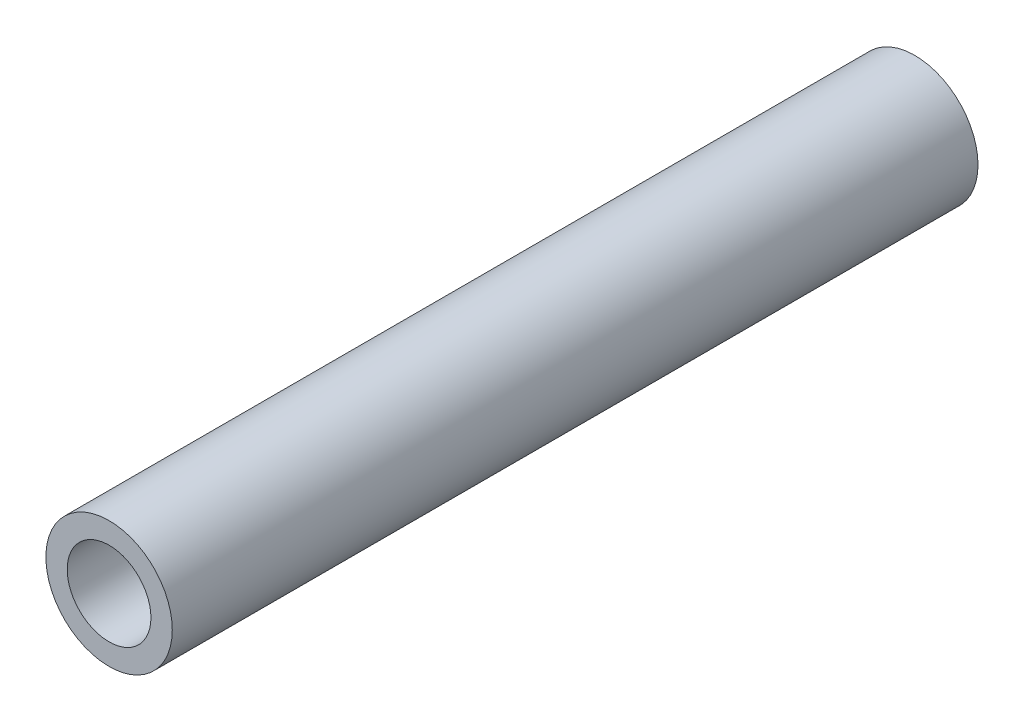
ISO-10303-21;
HEADER;
FILE_DESCRIPTION(('STEP AP214'),'2;1');
FILE_NAME('part.step','',(''),(''),'','','');
FILE_SCHEMA(('AUTOMOTIVE_DESIGN { 1 0 10303 214 1 1 1 1 }'));
ENDSEC;
DATA;
#1=APPLICATION_CONTEXT('core data for automotive mechanical design processes');
#2=APPLICATION_PROTOCOL_DEFINITION('international standard','automotive_design',2000,#1);
#3=PRODUCT_CONTEXT('',#1,'mechanical');
#4=PRODUCT('Part','Part','',(#3));
#5=PRODUCT_RELATED_PRODUCT_CATEGORY('part','',(#4));
#6=PRODUCT_DEFINITION_FORMATION('','',#4);
#7=PRODUCT_DEFINITION_CONTEXT('part definition',#1,'design');
#8=PRODUCT_DEFINITION('design','',#6,#7);
#9=PRODUCT_DEFINITION_SHAPE('','',#8);
#10=(LENGTH_UNIT() NAMED_UNIT(*) SI_UNIT(.MILLI.,.METRE.));
#11=(NAMED_UNIT(*) PLANE_ANGLE_UNIT() SI_UNIT($,.RADIAN.));
#12=(NAMED_UNIT(*) SI_UNIT($,.STERADIAN.) SOLID_ANGLE_UNIT());
#13=UNCERTAINTY_MEASURE_WITH_UNIT(LENGTH_MEASURE(1.E-05),#10,'distance_accuracy_value','');
#14=(GEOMETRIC_REPRESENTATION_CONTEXT(3) GLOBAL_UNCERTAINTY_ASSIGNED_CONTEXT((#13)) GLOBAL_UNIT_ASSIGNED_CONTEXT((#10,
#11,#12)) REPRESENTATION_CONTEXT('',''));
#15=CARTESIAN_POINT('',(0.,0.,0.));
#16=DIRECTION('',(0.,0.,1.));
#17=DIRECTION('',(1.,0.,0.));
#18=AXIS2_PLACEMENT_3D('',#15,#16,#17);
#19=CARTESIAN_POINT('',(0.,0.,25.5));
#20=DIRECTION('',(0.,0.,1.));
#21=DIRECTION('',(1.,0.,0.));
#22=AXIS2_PLACEMENT_3D('',#19,#20,#21);
#23=PLANE('',#22);
#24=CARTESIAN_POINT('',(0.,0.,25.5));
#25=DIRECTION('',(0.,0.,1.));
#26=DIRECTION('',(1.,0.,0.));
#27=AXIS2_PLACEMENT_3D('',#24,#25,#26);
#28=CIRCLE('',#27,4.);
#29=CARTESIAN_POINT('',(4.,0.,25.5));
#30=VERTEX_POINT('',#29);
#31=EDGE_CURVE('E10',#30,#30,#28,.T.);
#32=ORIENTED_EDGE('',*,*,#31,.T.);
#33=EDGE_LOOP('',(#32));
#34=FACE_BOUND('',#33,.T.);
#35=CARTESIAN_POINT('',(0.,0.,25.5));
#36=DIRECTION('',(0.,0.,1.));
#37=DIRECTION('',(1.,0.,0.));
#38=AXIS2_PLACEMENT_3D('',#35,#36,#37);
#39=CIRCLE('',#38,2.65);
#40=CARTESIAN_POINT('',(2.65,0.,25.5));
#41=VERTEX_POINT('',#40);
#42=EDGE_CURVE('E44',#41,#41,#39,.T.);
#43=ORIENTED_EDGE('',*,*,#42,.F.);
#44=EDGE_LOOP('',(#43));
#45=FACE_BOUND('',#44,.T.);
#46=ADVANCED_FACE('F33',(#34,#45),#23,.T.);
#47=CARTESIAN_POINT('',(0.,0.,-25.5));
#48=DIRECTION('',(0.,0.,1.));
#49=DIRECTION('',(1.,0.,0.));
#50=AXIS2_PLACEMENT_3D('',#47,#48,#49);
#51=PLANE('',#50);
#52=CARTESIAN_POINT('',(0.,0.,-25.5));
#53=DIRECTION('',(0.,0.,1.));
#54=DIRECTION('',(1.,0.,0.));
#55=AXIS2_PLACEMENT_3D('',#52,#53,#54);
#56=CIRCLE('',#55,4.);
#57=CARTESIAN_POINT('',(4.,0.,-25.5));
#58=VERTEX_POINT('',#57);
#59=EDGE_CURVE('E37',#58,#58,#56,.T.);
#60=ORIENTED_EDGE('',*,*,#59,.F.);
#61=EDGE_LOOP('',(#60));
#62=FACE_BOUND('',#61,.T.);
#63=CARTESIAN_POINT('',(0.,0.,-25.5));
#64=DIRECTION('',(0.,0.,1.));
#65=DIRECTION('',(1.,0.,0.));
#66=AXIS2_PLACEMENT_3D('',#63,#64,#65);
#67=CIRCLE('',#66,2.65);
#68=CARTESIAN_POINT('',(2.65,0.,-25.5));
#69=VERTEX_POINT('',#68);
#70=EDGE_CURVE('E46',#69,#69,#67,.T.);
#71=ORIENTED_EDGE('',*,*,#70,.T.);
#72=EDGE_LOOP('',(#71));
#73=FACE_BOUND('',#72,.T.);
#74=ADVANCED_FACE('F56',(#62,#73),#51,.F.);
#75=CARTESIAN_POINT('',(0.,0.,25.5));
#76=DIRECTION('',(0.,0.,-1.));
#77=DIRECTION('',(-1.,0.,0.));
#78=AXIS2_PLACEMENT_3D('',#75,#76,#77);
#79=CYLINDRICAL_SURFACE('',#78,4.);
#80=ORIENTED_EDGE('',*,*,#31,.F.);
#81=EDGE_LOOP('',(#80));
#82=FACE_BOUND('',#81,.T.);
#83=ORIENTED_EDGE('',*,*,#59,.T.);
#84=EDGE_LOOP('',(#83));
#85=FACE_BOUND('',#84,.T.);
#86=ADVANCED_FACE('F35',(#82,#85),#79,.T.);
#87=CARTESIAN_POINT('',(0.,0.,25.5));
#88=DIRECTION('',(0.,0.,-1.));
#89=DIRECTION('',(-1.,0.,0.));
#90=AXIS2_PLACEMENT_3D('',#87,#88,#89);
#91=CYLINDRICAL_SURFACE('',#90,2.65);
#92=ORIENTED_EDGE('',*,*,#42,.T.);
#93=EDGE_LOOP('',(#92));
#94=FACE_BOUND('',#93,.T.);
#95=ORIENTED_EDGE('',*,*,#70,.F.);
#96=EDGE_LOOP('',(#95));
#97=FACE_BOUND('',#96,.T.);
#98=ADVANCED_FACE('F52',(#94,#97),#91,.F.);
#99=CLOSED_SHELL('',(#46,#74,#86,#98));
#100=MANIFOLD_SOLID_BREP('B2',#99);
#101=ADVANCED_BREP_SHAPE_REPRESENTATION('',(#18,#100),#14);
#102=SHAPE_DEFINITION_REPRESENTATION(#9,#101);
ENDSEC;
END-ISO-10303-21;
